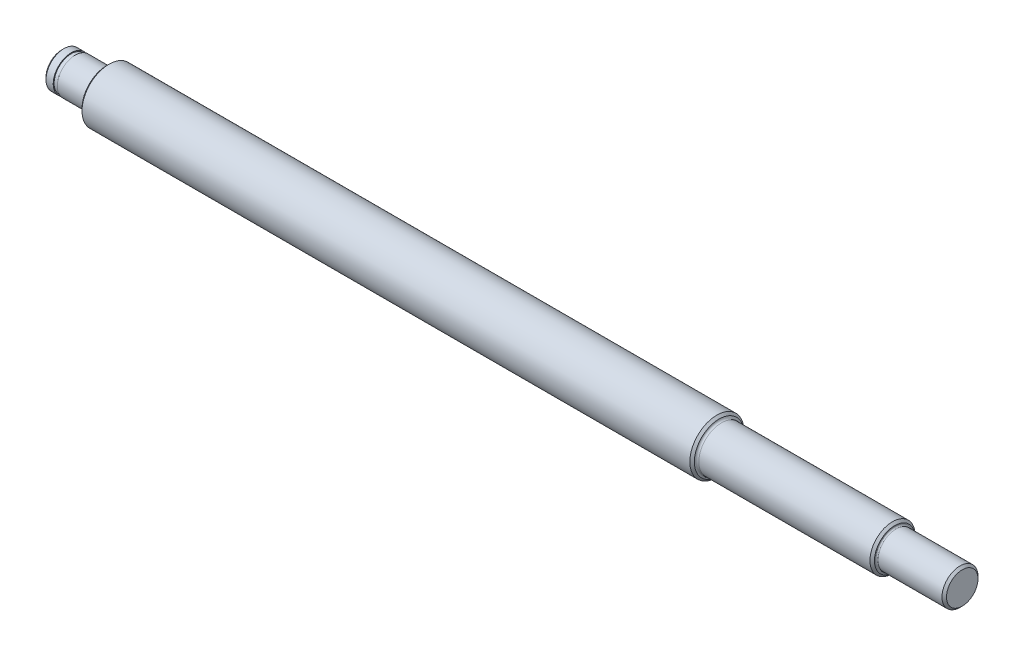
ISO-10303-21;
HEADER;
FILE_DESCRIPTION(('STEP AP214'),'2;1');
FILE_NAME('part.step','',(''),(''),'','','');
FILE_SCHEMA(('AUTOMOTIVE_DESIGN { 1 0 10303 214 1 1 1 1 }'));
ENDSEC;
DATA;
#1=APPLICATION_CONTEXT('core data for automotive mechanical design processes');
#2=APPLICATION_PROTOCOL_DEFINITION('international standard','automotive_design',2000,#1);
#3=PRODUCT_CONTEXT('',#1,'mechanical');
#4=PRODUCT('Part','Part','',(#3));
#5=PRODUCT_RELATED_PRODUCT_CATEGORY('part','',(#4));
#6=PRODUCT_DEFINITION_FORMATION('','',#4);
#7=PRODUCT_DEFINITION_CONTEXT('part definition',#1,'design');
#8=PRODUCT_DEFINITION('design','',#6,#7);
#9=PRODUCT_DEFINITION_SHAPE('','',#8);
#10=(LENGTH_UNIT() NAMED_UNIT(*) SI_UNIT(.MILLI.,.METRE.));
#11=(NAMED_UNIT(*) PLANE_ANGLE_UNIT() SI_UNIT($,.RADIAN.));
#12=(NAMED_UNIT(*) SI_UNIT($,.STERADIAN.) SOLID_ANGLE_UNIT());
#13=UNCERTAINTY_MEASURE_WITH_UNIT(LENGTH_MEASURE(1.E-05),#10,'distance_accuracy_value','');
#14=(GEOMETRIC_REPRESENTATION_CONTEXT(3) GLOBAL_UNCERTAINTY_ASSIGNED_CONTEXT((#13)) GLOBAL_UNIT_ASSIGNED_CONTEXT((#10,
#11,#12)) REPRESENTATION_CONTEXT('',''));
#15=CARTESIAN_POINT('',(0.,0.,0.));
#16=DIRECTION('',(0.,0.,1.));
#17=DIRECTION('',(1.,0.,0.));
#18=AXIS2_PLACEMENT_3D('',#15,#16,#17);
#19=CARTESIAN_POINT('',(0.,-3.50000000000003,3.50000026872561));
#20=DIRECTION('',(-1.,0.,0.));
#21=DIRECTION('',(0.,1.00000000000005,0.));
#22=AXIS2_PLACEMENT_3D('',#19,#20,#21);
#23=PLANE('',#22);
#24=CARTESIAN_POINT('',(0.,0.,0.));
#25=DIRECTION('',(-1.,0.,0.));
#26=DIRECTION('',(0.,0.,-1.00000000000005));
#27=AXIS2_PLACEMENT_3D('',#24,#25,#26);
#28=CIRCLE('',#27,3.5);
#29=CARTESIAN_POINT('',(0.,0.,-3.50000000000018));
#30=VERTEX_POINT('',#29);
#31=EDGE_CURVE('E77',#30,#30,#28,.F.);
#32=ORIENTED_EDGE('',*,*,#31,.F.);
#33=EDGE_LOOP('',(#32));
#34=FACE_BOUND('',#33,.T.);
#35=ADVANCED_FACE('F15',(#34),#23,.T.);
#36=CARTESIAN_POINT('',(2.1,-4.00000000000231,-3.9999999999993));
#37=DIRECTION('',(1.,0.,0.));
#38=DIRECTION('',(0.,1.00000000000005,0.));
#39=AXIS2_PLACEMENT_3D('',#36,#37,#38);
#40=PLANE('',#39);
#41=CARTESIAN_POINT('',(2.1,-1.97064586870965E-12,8.11850586757146E-13));
#42=DIRECTION('',(1.,0.,0.));
#43=DIRECTION('',(0.,0.,1.00000000000005));
#44=AXIS2_PLACEMENT_3D('',#41,#42,#43);
#45=CIRCLE('',#44,4.);
#46=CARTESIAN_POINT('',(2.1,-1.97086791331458E-12,4.00000000000101));
#47=VERTEX_POINT('',#46);
#48=EDGE_CURVE('E74',#47,#47,#45,.T.);
#49=ORIENTED_EDGE('',*,*,#48,.T.);
#50=EDGE_LOOP('',(#49));
#51=FACE_BOUND('',#50,.T.);
#52=CARTESIAN_POINT('',(2.1,-1.97064586870965E-12,8.11850586757146E-13));
#53=DIRECTION('',(-1.,0.,0.));
#54=DIRECTION('',(0.,0.,-1.00000000000005));
#55=AXIS2_PLACEMENT_3D('',#52,#53,#54);
#56=CIRCLE('',#55,3.8);
#57=CARTESIAN_POINT('',(2.1,-1.9731771772058E-12,-3.79999999999938));
#58=VERTEX_POINT('',#57);
#59=EDGE_CURVE('E71',#58,#58,#56,.F.);
#60=ORIENTED_EDGE('',*,*,#59,.F.);
#61=EDGE_LOOP('',(#60));
#62=FACE_BOUND('',#61,.T.);
#63=ADVANCED_FACE('F84',(#51,#62),#40,.T.);
#64=CARTESIAN_POINT('',(3.,-4.00000000000239,4.00000000000079));
#65=DIRECTION('',(-1.,0.,0.));
#66=DIRECTION('',(0.,1.00000000000005,0.));
#67=AXIS2_PLACEMENT_3D('',#64,#65,#66);
#68=PLANE('',#67);
#69=CARTESIAN_POINT('',(3.,-1.74860126378462E-12,5.82867087928207E-13));
#70=DIRECTION('',(-1.,0.,0.));
#71=DIRECTION('',(0.,0.,-1.00000000000005));
#72=AXIS2_PLACEMENT_3D('',#69,#70,#71);
#73=CIRCLE('',#72,4.);
#74=CARTESIAN_POINT('',(3.,-1.75126579904372E-12,-3.99999999999961));
#75=VERTEX_POINT('',#74);
#76=EDGE_CURVE('E68',#75,#75,#73,.F.);
#77=ORIENTED_EDGE('',*,*,#76,.F.);
#78=EDGE_LOOP('',(#77));
#79=FACE_BOUND('',#78,.T.);
#80=CARTESIAN_POINT('',(3.,-1.74860126378462E-12,5.82867087928207E-13));
#81=DIRECTION('',(1.,0.,0.));
#82=DIRECTION('',(0.,-1.42352611476326E-07,1.00000000000004));
#83=AXIS2_PLACEMENT_3D('',#80,#81,#82);
#84=CIRCLE('',#83,3.8);
#85=CARTESIAN_POINT('',(3.,-5.40941672211304E-07,3.80000000000073));
#86=VERTEX_POINT('',#85);
#87=EDGE_CURVE('E65',#86,#86,#84,.T.);
#88=ORIENTED_EDGE('',*,*,#87,.T.);
#89=EDGE_LOOP('',(#88));
#90=FACE_BOUND('',#89,.T.);
#91=ADVANCED_FACE('F90',(#79,#90),#68,.T.);
#92=CARTESIAN_POINT('',(10.,-5.50000000000236,5.50000000000054));
#93=DIRECTION('',(-1.,0.,0.));
#94=DIRECTION('',(0.,1.00000000000005,0.));
#95=AXIS2_PLACEMENT_3D('',#92,#93,#94);
#96=PLANE('',#95);
#97=CARTESIAN_POINT('',(10.,-2.02615701994091E-12,3.67761376907083E-13));
#98=DIRECTION('',(-1.,0.,0.));
#99=DIRECTION('',(0.,0.,-1.00000000000005));
#100=AXIS2_PLACEMENT_3D('',#97,#98,#99);
#101=CIRCLE('',#100,5.5);
#102=CARTESIAN_POINT('',(10.,-2.02982075592217E-12,-5.4999999999999));
#103=VERTEX_POINT('',#102);
#104=EDGE_CURVE('E62',#103,#103,#101,.F.);
#105=ORIENTED_EDGE('',*,*,#104,.F.);
#106=EDGE_LOOP('',(#105));
#107=FACE_BOUND('',#106,.T.);
#108=CARTESIAN_POINT('',(10.,-2.02615701994091E-12,3.67761376907083E-13));
#109=DIRECTION('',(1.,0.,0.));
#110=DIRECTION('',(0.,0.,1.00000000000005));
#111=AXIS2_PLACEMENT_3D('',#108,#109,#110);
#112=CIRCLE('',#111,4.5);
#113=CARTESIAN_POINT('',(10.,-2.02340921795496E-12,4.50000000000059));
#114=VERTEX_POINT('',#113);
#115=EDGE_CURVE('E59',#114,#114,#112,.T.);
#116=ORIENTED_EDGE('',*,*,#115,.T.);
#117=EDGE_LOOP('',(#116));
#118=FACE_BOUND('',#117,.T.);
#119=ADVANCED_FACE('F96',(#107,#118),#96,.T.);
#120=CARTESIAN_POINT('',(185.,-4.50000000000023,-4.49999999999985));
#121=DIRECTION('',(1.,0.,0.));
#122=DIRECTION('',(0.,1.00000000000005,0.));
#123=AXIS2_PLACEMENT_3D('',#120,#121,#122);
#124=PLANE('',#123);
#125=CARTESIAN_POINT('',(185.,3.05311331771918E-13,0.));
#126=DIRECTION('',(1.,0.,0.));
#127=DIRECTION('',(0.,0.,1.00000000000005));
#128=AXIS2_PLACEMENT_3D('',#125,#126,#127);
#129=CIRCLE('',#128,4.5);
#130=CARTESIAN_POINT('',(185.,3.08059133757865E-13,4.50000000000019));
#131=VERTEX_POINT('',#130);
#132=EDGE_CURVE('E56',#131,#131,#129,.T.);
#133=ORIENTED_EDGE('',*,*,#132,.T.);
#134=EDGE_LOOP('',(#133));
#135=FACE_BOUND('',#134,.T.);
#136=CARTESIAN_POINT('',(185.,3.05311331771918E-13,0.));
#137=DIRECTION('',(-1.,0.,0.));
#138=DIRECTION('',(0.,0.,-1.00000000000005));
#139=AXIS2_PLACEMENT_3D('',#136,#137,#138);
#140=CIRCLE('',#139,4.30000023535596);
#141=CARTESIAN_POINT('',(185.,3.05550029735277E-13,-4.30000023535622));
#142=VERTEX_POINT('',#141);
#143=EDGE_CURVE('E53',#142,#142,#140,.F.);
#144=ORIENTED_EDGE('',*,*,#143,.F.);
#145=EDGE_LOOP('',(#144));
#146=FACE_BOUND('',#145,.T.);
#147=ADVANCED_FACE('F100',(#135,#146),#124,.T.);
#148=CARTESIAN_POINT('',(200.,-3.4999999999997,-3.50000000000014));
#149=DIRECTION('',(1.,0.,0.));
#150=DIRECTION('',(0.,1.00000000000005,0.));
#151=AXIS2_PLACEMENT_3D('',#148,#149,#150);
#152=PLANE('',#151);
#153=CARTESIAN_POINT('',(200.,2.77555756156289E-13,0.));
#154=DIRECTION('',(1.,0.,0.));
#155=DIRECTION('',(0.,0.,1.00000000000005));
#156=AXIS2_PLACEMENT_3D('',#153,#154,#155);
#157=CIRCLE('',#156,3.5);
#158=CARTESIAN_POINT('',(200.,2.79887224508002E-13,3.50000000000011));
#159=VERTEX_POINT('',#158);
#160=EDGE_CURVE('E50',#159,#159,#157,.T.);
#161=ORIENTED_EDGE('',*,*,#160,.T.);
#162=EDGE_LOOP('',(#161));
#163=FACE_BOUND('',#162,.T.);
#164=ADVANCED_FACE('F104',(#163),#152,.T.);
#165=CARTESIAN_POINT('',(0.5,0.,0.));
#166=DIRECTION('',(1.,0.,0.));
#167=DIRECTION('',(0.,1.42067167030469E-07,1.00000000000004));
#168=AXIS2_PLACEMENT_3D('',#165,#166,#167);
#169=CONICAL_SURFACE('',#168,4.,0.785398163397447);
#170=CARTESIAN_POINT('',(0.5,0.,0.));
#171=DIRECTION('',(-1.,0.,0.));
#172=DIRECTION('',(0.,0.,-1.00000000000005));
#173=AXIS2_PLACEMENT_3D('',#170,#171,#172);
#174=CIRCLE('',#173,4.);
#175=CARTESIAN_POINT('',(0.5,0.,-4.0000000000002));
#176=VERTEX_POINT('',#175);
#177=EDGE_CURVE('E47',#176,#176,#174,.F.);
#178=ORIENTED_EDGE('',*,*,#177,.F.);
#179=EDGE_LOOP('',(#178));
#180=FACE_BOUND('',#179,.T.);
#181=ORIENTED_EDGE('',*,*,#31,.T.);
#182=EDGE_LOOP('',(#181));
#183=FACE_BOUND('',#182,.T.);
#184=ADVANCED_FACE('F81',(#180,#183),#169,.T.);
#185=CARTESIAN_POINT('',(146.5,-1.08246744900953E-12,-2.28983498828939E-13));
#186=DIRECTION('',(1.,0.,0.));
#187=DIRECTION('',(0.,7.69313335258204E-10,1.00000000000005));
#188=AXIS2_PLACEMENT_3D('',#185,#186,#187);
#189=CYLINDRICAL_SURFACE('',#188,4.);
#190=ORIENTED_EDGE('',*,*,#48,.F.);
#191=EDGE_LOOP('',(#190));
#192=FACE_BOUND('',#191,.T.);
#193=ORIENTED_EDGE('',*,*,#177,.T.);
#194=EDGE_LOOP('',(#193));
#195=FACE_BOUND('',#194,.T.);
#196=ADVANCED_FACE('F111',(#192,#195),#189,.T.);
#197=CARTESIAN_POINT('',(146.5,-1.08246744900953E-12,-2.28983498828939E-13));
#198=DIRECTION('',(1.,0.,0.));
#199=DIRECTION('',(0.,0.,1.00000000000005));
#200=AXIS2_PLACEMENT_3D('',#197,#198,#199);
#201=CYLINDRICAL_SURFACE('',#200,3.8);
#202=ORIENTED_EDGE('',*,*,#87,.F.);
#203=EDGE_LOOP('',(#202));
#204=FACE_BOUND('',#203,.T.);
#205=ORIENTED_EDGE('',*,*,#59,.T.);
#206=EDGE_LOOP('',(#205));
#207=FACE_BOUND('',#206,.T.);
#208=ADVANCED_FACE('F115',(#204,#207),#201,.T.);
#209=CARTESIAN_POINT('',(146.5,-1.08246744900953E-12,-2.28983498828939E-13));
#210=DIRECTION('',(1.,0.,0.));
#211=DIRECTION('',(0.,1.92348637018114E-10,1.00000000000005));
#212=AXIS2_PLACEMENT_3D('',#209,#210,#211);
#213=CYLINDRICAL_SURFACE('',#212,4.);
#214=CARTESIAN_POINT('',(9.5,-2.08166817117217E-12,3.67761376907083E-13));
#215=DIRECTION('',(-1.,0.,0.));
#216=DIRECTION('',(0.,0.,-1.00000000000005));
#217=AXIS2_PLACEMENT_3D('',#214,#215,#216);
#218=CIRCLE('',#217,4.);
#219=CARTESIAN_POINT('',(9.5,-2.08433270643127E-12,-3.99999999999983));
#220=VERTEX_POINT('',#219);
#221=EDGE_CURVE('E44',#220,#220,#218,.F.);
#222=ORIENTED_EDGE('',*,*,#221,.F.);
#223=EDGE_LOOP('',(#222));
#224=FACE_BOUND('',#223,.T.);
#225=ORIENTED_EDGE('',*,*,#76,.T.);
#226=EDGE_LOOP('',(#225));
#227=FACE_BOUND('',#226,.T.);
#228=ADVANCED_FACE('F119',(#224,#227),#213,.T.);
#229=CARTESIAN_POINT('',(9.5,-2.08166817117217E-12,3.67761376907083E-13));
#230=DIRECTION('',(1.,0.,0.));
#231=DIRECTION('',(0.,7.69394048472094E-10,1.00000000000005));
#232=AXIS2_PLACEMENT_3D('',#229,#230,#231);
#233=TOROIDAL_SURFACE('',#232,4.49999999999991,0.499999999999911);
#234=ORIENTED_EDGE('',*,*,#115,.F.);
#235=EDGE_LOOP('',(#234));
#236=FACE_BOUND('',#235,.T.);
#237=ORIENTED_EDGE('',*,*,#221,.T.);
#238=EDGE_LOOP('',(#237));
#239=FACE_BOUND('',#238,.T.);
#240=ADVANCED_FACE('F123',(#236,#239),#233,.F.);
#241=CARTESIAN_POINT('',(10.5,-2.02615701994091E-12,3.67761376907083E-13));
#242=DIRECTION('',(1.,0.,0.));
#243=DIRECTION('',(0.,1.92331373050081E-10,1.00000000000005));
#244=AXIS2_PLACEMENT_3D('',#241,#242,#243);
#245=CONICAL_SURFACE('',#244,6.,0.785398163397447);
#246=CARTESIAN_POINT('',(10.5,-2.02615701994091E-12,3.67761376907083E-13));
#247=DIRECTION('',(-1.,0.,0.));
#248=DIRECTION('',(0.,0.,-1.00000000000005));
#249=AXIS2_PLACEMENT_3D('',#246,#247,#248);
#250=CIRCLE('',#249,6.);
#251=CARTESIAN_POINT('',(10.5,-2.03015382282956E-12,-5.99999999999993));
#252=VERTEX_POINT('',#251);
#253=EDGE_CURVE('E41',#252,#252,#250,.F.);
#254=ORIENTED_EDGE('',*,*,#253,.F.);
#255=EDGE_LOOP('',(#254));
#256=FACE_BOUND('',#255,.T.);
#257=ORIENTED_EDGE('',*,*,#104,.T.);
#258=EDGE_LOOP('',(#257));
#259=FACE_BOUND('',#258,.T.);
#260=ADVANCED_FACE('F127',(#256,#259),#245,.T.);
#261=CARTESIAN_POINT('',(146.5,-1.08246744900953E-12,-2.28983498828939E-13));
#262=DIRECTION('',(1.,0.,0.));
#263=DIRECTION('',(0.,7.69327712646373E-10,1.00000000000005));
#264=AXIS2_PLACEMENT_3D('',#261,#262,#263);
#265=CYLINDRICAL_SURFACE('',#264,6.);
#266=CARTESIAN_POINT('',(145.5,-1.13797860024079E-12,-2.15105711021124E-13));
#267=DIRECTION('',(-1.,0.,0.));
#268=DIRECTION('',(0.,0.,-1.00000000000005));
#269=AXIS2_PLACEMENT_3D('',#266,#267,#268);
#270=CIRCLE('',#269,6.);
#271=CARTESIAN_POINT('',(145.5,-1.14197540312944E-12,-6.00000000000051));
#272=VERTEX_POINT('',#271);
#273=EDGE_CURVE('E38',#272,#272,#270,.F.);
#274=ORIENTED_EDGE('',*,*,#273,.F.);
#275=EDGE_LOOP('',(#274));
#276=FACE_BOUND('',#275,.T.);
#277=ORIENTED_EDGE('',*,*,#253,.T.);
#278=EDGE_LOOP('',(#277));
#279=FACE_BOUND('',#278,.T.);
#280=ADVANCED_FACE('F131',(#276,#279),#265,.T.);
#281=CARTESIAN_POINT('',(145.5,-1.13797860024079E-12,-2.15105711021124E-13));
#282=DIRECTION('',(-1.,0.,0.));
#283=DIRECTION('',(0.,0.,-1.00000000000005));
#284=AXIS2_PLACEMENT_3D('',#281,#282,#283);
#285=CONICAL_SURFACE('',#284,6.,0.785398163397447);
#286=CARTESIAN_POINT('',(146.,-1.13797860024079E-12,-2.15105711021124E-13));
#287=DIRECTION('',(-1.,0.,0.));
#288=DIRECTION('',(0.,0.,-1.00000000000005));
#289=AXIS2_PLACEMENT_3D('',#286,#287,#288);
#290=CIRCLE('',#289,5.5);
#291=CARTESIAN_POINT('',(146.,-1.13706266624547E-12,-5.50000000000049));
#292=VERTEX_POINT('',#291);
#293=EDGE_CURVE('E35',#292,#292,#290,.F.);
#294=ORIENTED_EDGE('',*,*,#293,.F.);
#295=EDGE_LOOP('',(#294));
#296=FACE_BOUND('',#295,.T.);
#297=ORIENTED_EDGE('',*,*,#273,.T.);
#298=EDGE_LOOP('',(#297));
#299=FACE_BOUND('',#298,.T.);
#300=ADVANCED_FACE('F135',(#296,#299),#285,.T.);
#301=CARTESIAN_POINT('',(146.500000000006,-1.08246744900953E-12,-2.28983498828939E-13));
#302=DIRECTION('',(1.,0.,0.));
#303=DIRECTION('',(0.,1.92321769620918E-10,1.00000000000005));
#304=AXIS2_PLACEMENT_3D('',#301,#302,#303);
#305=TOROIDAL_SURFACE('',#304,5.50000000000558,0.500000000005579);
#306=CARTESIAN_POINT('',(146.5,-1.08246744900953E-12,-2.28983498828939E-13));
#307=DIRECTION('',(-1.,0.,0.));
#308=DIRECTION('',(0.,0.,-1.00000000000005));
#309=AXIS2_PLACEMENT_3D('',#306,#307,#308);
#310=CIRCLE('',#309,5.);
#311=CARTESIAN_POINT('',(146.5,-1.0857981180834E-12,-5.00000000000048));
#312=VERTEX_POINT('',#311);
#313=EDGE_CURVE('E30',#312,#312,#310,.F.);
#314=ORIENTED_EDGE('',*,*,#313,.F.);
#315=EDGE_LOOP('',(#314));
#316=FACE_BOUND('',#315,.T.);
#317=ORIENTED_EDGE('',*,*,#293,.T.);
#318=EDGE_LOOP('',(#317));
#319=FACE_BOUND('',#318,.T.);
#320=ADVANCED_FACE('F139',(#316,#319),#305,.F.);
#321=CARTESIAN_POINT('',(200.,2.77555756156289E-13,0.));
#322=DIRECTION('',(1.,0.,0.));
#323=DIRECTION('',(0.,0.,1.00000000000005));
#324=AXIS2_PLACEMENT_3D('',#321,#322,#323);
#325=CYLINDRICAL_SURFACE('',#324,5.);
#326=CARTESIAN_POINT('',(184.5,3.05311331771918E-13,0.));
#327=DIRECTION('',(-1.,0.,0.));
#328=DIRECTION('',(0.,0.,-1.00000000000005));
#329=AXIS2_PLACEMENT_3D('',#326,#327,#328);
#330=CIRCLE('',#329,5.);
#331=CARTESIAN_POINT('',(184.5,3.01980662698043E-13,-5.00000000000029));
#332=VERTEX_POINT('',#331);
#333=EDGE_CURVE('E26',#332,#332,#330,.F.);
#334=ORIENTED_EDGE('',*,*,#333,.F.);
#335=EDGE_LOOP('',(#334));
#336=FACE_BOUND('',#335,.T.);
#337=ORIENTED_EDGE('',*,*,#313,.T.);
#338=EDGE_LOOP('',(#337));
#339=FACE_BOUND('',#338,.T.);
#340=ADVANCED_FACE('F143',(#336,#339),#325,.T.);
#341=CARTESIAN_POINT('',(184.5,3.05311331771918E-13,0.));
#342=DIRECTION('',(-1.,0.,0.));
#343=DIRECTION('',(0.,0.,-1.00000000000005));
#344=AXIS2_PLACEMENT_3D('',#341,#342,#343);
#345=CONICAL_SURFACE('',#344,5.,0.785398163397447);
#346=ORIENTED_EDGE('',*,*,#132,.F.);
#347=EDGE_LOOP('',(#346));
#348=FACE_BOUND('',#347,.T.);
#349=ORIENTED_EDGE('',*,*,#333,.T.);
#350=EDGE_LOOP('',(#349));
#351=FACE_BOUND('',#350,.T.);
#352=ADVANCED_FACE('F147',(#348,#351),#345,.T.);
#353=CARTESIAN_POINT('',(185.299999999993,3.05311331771918E-13,0.));
#354=DIRECTION('',(1.,0.,0.));
#355=DIRECTION('',(0.,1.92368621032557E-10,1.00000000000005));
#356=AXIS2_PLACEMENT_3D('',#353,#354,#355);
#357=TOROIDAL_SURFACE('',#356,4.29999999999307,0.299999999993084);
#358=CARTESIAN_POINT('',(185.3,3.05311331771918E-13,0.));
#359=DIRECTION('',(-1.,0.,0.));
#360=DIRECTION('',(0.,0.,-1.00000000000005));
#361=AXIS2_PLACEMENT_3D('',#358,#359,#360);
#362=CIRCLE('',#361,3.99999999999999);
#363=CARTESIAN_POINT('',(185.3,3.02646796512818E-13,-4.00000000000023));
#364=VERTEX_POINT('',#363);
#365=EDGE_CURVE('E22',#364,#364,#362,.F.);
#366=ORIENTED_EDGE('',*,*,#365,.F.);
#367=EDGE_LOOP('',(#366));
#368=FACE_BOUND('',#367,.T.);
#369=ORIENTED_EDGE('',*,*,#143,.T.);
#370=EDGE_LOOP('',(#369));
#371=FACE_BOUND('',#370,.T.);
#372=ADVANCED_FACE('F151',(#368,#371),#357,.F.);
#373=CARTESIAN_POINT('',(200.,2.77555756156289E-13,0.));
#374=DIRECTION('',(1.,0.,0.));
#375=DIRECTION('',(0.,7.69475649864404E-10,1.00000000000005));
#376=AXIS2_PLACEMENT_3D('',#373,#374,#375);
#377=CYLINDRICAL_SURFACE('',#376,4.);
#378=CARTESIAN_POINT('',(199.5,2.77555756156289E-13,0.));
#379=DIRECTION('',(-1.,0.,0.));
#380=DIRECTION('',(0.,0.,-1.00000000000005));
#381=AXIS2_PLACEMENT_3D('',#378,#379,#380);
#382=CIRCLE('',#381,4.);
#383=CARTESIAN_POINT('',(199.5,2.8022029141539E-13,-4.00000000000026));
#384=VERTEX_POINT('',#383);
#385=EDGE_CURVE('E10',#384,#384,#382,.F.);
#386=ORIENTED_EDGE('',*,*,#385,.F.);
#387=EDGE_LOOP('',(#386));
#388=FACE_BOUND('',#387,.T.);
#389=ORIENTED_EDGE('',*,*,#365,.T.);
#390=EDGE_LOOP('',(#389));
#391=FACE_BOUND('',#390,.T.);
#392=ADVANCED_FACE('F154',(#388,#391),#377,.T.);
#393=CARTESIAN_POINT('',(199.5,2.77555756156289E-13,0.));
#394=DIRECTION('',(-1.,0.,0.));
#395=DIRECTION('',(0.,0.,-1.00000000000005));
#396=AXIS2_PLACEMENT_3D('',#393,#394,#395);
#397=CONICAL_SURFACE('',#396,4.,0.785398163397447);
#398=ORIENTED_EDGE('',*,*,#160,.F.);
#399=EDGE_LOOP('',(#398));
#400=FACE_BOUND('',#399,.T.);
#401=ORIENTED_EDGE('',*,*,#385,.T.);
#402=EDGE_LOOP('',(#401));
#403=FACE_BOUND('',#402,.T.);
#404=ADVANCED_FACE('F17',(#400,#403),#397,.T.);
#405=CLOSED_SHELL('',(#35,#63,#91,#119,#147,#164,#184,#196,#208,#228,#240,#260,#280,#300,#320,
#340,#352,#372,#392,#404));
#406=MANIFOLD_SOLID_BREP('B1',#405);
#407=ADVANCED_BREP_SHAPE_REPRESENTATION('',(#18,#406),#14);
#408=SHAPE_DEFINITION_REPRESENTATION(#9,#407);
ENDSEC;
END-ISO-10303-21;
